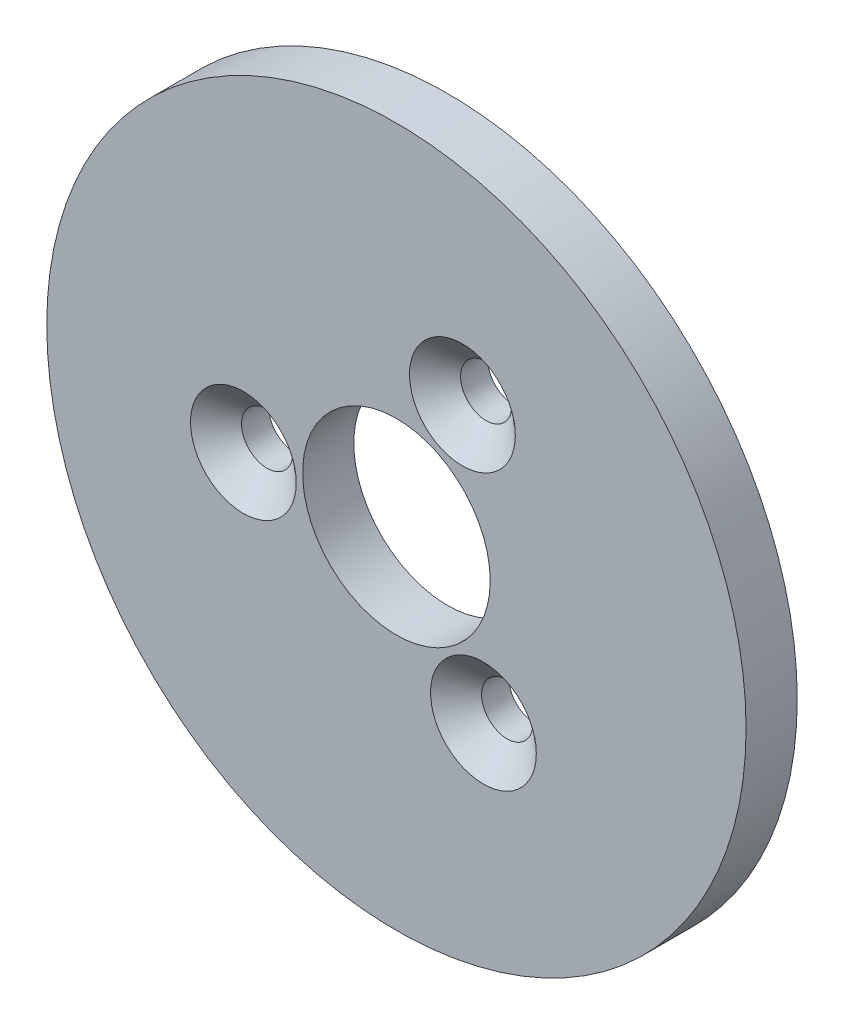
ISO-10303-21;
HEADER;
FILE_DESCRIPTION(('STEP AP214'),'2;1');
FILE_NAME('part.step','',(''),(''),'','','');
FILE_SCHEMA(('AUTOMOTIVE_DESIGN { 1 0 10303 214 1 1 1 1 }'));
ENDSEC;
DATA;
#1=APPLICATION_CONTEXT('core data for automotive mechanical design processes');
#2=APPLICATION_PROTOCOL_DEFINITION('international standard','automotive_design',2000,#1);
#3=PRODUCT_CONTEXT('',#1,'mechanical');
#4=PRODUCT('Part','Part','',(#3));
#5=PRODUCT_RELATED_PRODUCT_CATEGORY('part','',(#4));
#6=PRODUCT_DEFINITION_FORMATION('','',#4);
#7=PRODUCT_DEFINITION_CONTEXT('part definition',#1,'design');
#8=PRODUCT_DEFINITION('design','',#6,#7);
#9=PRODUCT_DEFINITION_SHAPE('','',#8);
#10=(LENGTH_UNIT() NAMED_UNIT(*) SI_UNIT(.MILLI.,.METRE.));
#11=(NAMED_UNIT(*) PLANE_ANGLE_UNIT() SI_UNIT($,.RADIAN.));
#12=(NAMED_UNIT(*) SI_UNIT($,.STERADIAN.) SOLID_ANGLE_UNIT());
#13=UNCERTAINTY_MEASURE_WITH_UNIT(LENGTH_MEASURE(1.E-05),#10,'distance_accuracy_value','');
#14=(GEOMETRIC_REPRESENTATION_CONTEXT(3) GLOBAL_UNCERTAINTY_ASSIGNED_CONTEXT((#13)) GLOBAL_UNIT_ASSIGNED_CONTEXT((#10,
#11,#12)) REPRESENTATION_CONTEXT('',''));
#15=CARTESIAN_POINT('',(0.,0.,0.));
#16=DIRECTION('',(0.,0.,1.));
#17=DIRECTION('',(1.,0.,0.));
#18=AXIS2_PLACEMENT_3D('',#15,#16,#17);
#19=CARTESIAN_POINT('',(0.,0.,3.));
#20=DIRECTION('',(0.,0.,-1.));
#21=DIRECTION('',(-1.,0.,0.));
#22=AXIS2_PLACEMENT_3D('',#19,#20,#21);
#23=CYLINDRICAL_SURFACE('',#22,20.5);
#24=CARTESIAN_POINT('',(0.,0.,3.));
#25=DIRECTION('',(0.,0.,1.));
#26=DIRECTION('',(1.,0.,0.));
#27=AXIS2_PLACEMENT_3D('',#24,#25,#26);
#28=CIRCLE('',#27,20.5);
#29=CARTESIAN_POINT('',(20.5,0.,3.));
#30=VERTEX_POINT('',#29);
#31=EDGE_CURVE('E57',#30,#30,#28,.T.);
#32=ORIENTED_EDGE('',*,*,#31,.F.);
#33=EDGE_LOOP('',(#32));
#34=FACE_BOUND('',#33,.T.);
#35=CARTESIAN_POINT('',(0.,0.,0.));
#36=DIRECTION('',(0.,0.,1.));
#37=DIRECTION('',(1.,0.,0.));
#38=AXIS2_PLACEMENT_3D('',#35,#36,#37);
#39=CIRCLE('',#38,20.5);
#40=CARTESIAN_POINT('',(20.5,0.,0.));
#41=VERTEX_POINT('',#40);
#42=EDGE_CURVE('E58',#41,#41,#39,.T.);
#43=ORIENTED_EDGE('',*,*,#42,.T.);
#44=EDGE_LOOP('',(#43));
#45=FACE_BOUND('',#44,.T.);
#46=ADVANCED_FACE('F31',(#34,#45),#23,.T.);
#47=CARTESIAN_POINT('',(0.,0.,3.));
#48=DIRECTION('',(0.,0.,1.));
#49=DIRECTION('',(1.,0.,0.));
#50=AXIS2_PLACEMENT_3D('',#47,#48,#49);
#51=PLANE('',#50);
#52=CARTESIAN_POINT('',(0.,0.,3.));
#53=DIRECTION('',(0.,0.,1.));
#54=DIRECTION('',(1.,0.,0.));
#55=AXIS2_PLACEMENT_3D('',#52,#53,#54);
#56=CIRCLE('',#55,5.5);
#57=CARTESIAN_POINT('',(5.5,0.,3.));
#58=VERTEX_POINT('',#57);
#59=EDGE_CURVE('E73',#58,#58,#56,.T.);
#60=ORIENTED_EDGE('',*,*,#59,.F.);
#61=EDGE_LOOP('',(#60));
#62=FACE_BOUND('',#61,.T.);
#63=CARTESIAN_POINT('',(-8.97185967817487,-0.711149713590536,3.));
#64=DIRECTION('',(0.,0.,1.));
#65=DIRECTION('',(1.,0.,0.));
#66=AXIS2_PLACEMENT_3D('',#63,#64,#65);
#67=CIRCLE('',#66,3.10000000000001);
#68=CARTESIAN_POINT('',(-5.87185967817486,-0.711149713590536,3.));
#69=VERTEX_POINT('',#68);
#70=EDGE_CURVE('E42',#69,#69,#67,.F.);
#71=ORIENTED_EDGE('',*,*,#70,.T.);
#72=EDGE_LOOP('',(#71));
#73=FACE_BOUND('',#72,.T.);
#74=CARTESIAN_POINT('',(3.87005612122401,8.12543325728398,3.));
#75=DIRECTION('',(0.,0.,1.));
#76=DIRECTION('',(1.,0.,0.));
#77=AXIS2_PLACEMENT_3D('',#74,#75,#76);
#78=CIRCLE('',#77,3.10000000000001);
#79=CARTESIAN_POINT('',(6.97005612122401,8.12543325728398,3.));
#80=VERTEX_POINT('',#79);
#81=EDGE_CURVE('E46',#80,#80,#78,.F.);
#82=ORIENTED_EDGE('',*,*,#81,.T.);
#83=EDGE_LOOP('',(#82));
#84=FACE_BOUND('',#83,.T.);
#85=CARTESIAN_POINT('',(5.10180355695087,-7.41428354369345,3.));
#86=DIRECTION('',(0.,0.,1.));
#87=DIRECTION('',(1.,0.,0.));
#88=AXIS2_PLACEMENT_3D('',#85,#86,#87);
#89=CIRCLE('',#88,3.10000000000001);
#90=CARTESIAN_POINT('',(8.20180355695087,-7.41428354369345,3.));
#91=VERTEX_POINT('',#90);
#92=EDGE_CURVE('E51',#91,#91,#89,.F.);
#93=ORIENTED_EDGE('',*,*,#92,.T.);
#94=EDGE_LOOP('',(#93));
#95=FACE_BOUND('',#94,.T.);
#96=ORIENTED_EDGE('',*,*,#31,.T.);
#97=EDGE_LOOP('',(#96));
#98=FACE_BOUND('',#97,.T.);
#99=ADVANCED_FACE('F88',(#62,#73,#84,#95,#98),#51,.T.);
#100=CARTESIAN_POINT('',(0.,0.,0.));
#101=DIRECTION('',(0.,0.,1.));
#102=DIRECTION('',(1.,0.,0.));
#103=AXIS2_PLACEMENT_3D('',#100,#101,#102);
#104=PLANE('',#103);
#105=CARTESIAN_POINT('',(0.,0.,0.));
#106=DIRECTION('',(0.,0.,1.));
#107=DIRECTION('',(1.,0.,0.));
#108=AXIS2_PLACEMENT_3D('',#105,#106,#107);
#109=CIRCLE('',#108,5.5);
#110=CARTESIAN_POINT('',(5.5,0.,0.));
#111=VERTEX_POINT('',#110);
#112=EDGE_CURVE('E70',#111,#111,#109,.T.);
#113=ORIENTED_EDGE('',*,*,#112,.T.);
#114=EDGE_LOOP('',(#113));
#115=FACE_BOUND('',#114,.T.);
#116=CARTESIAN_POINT('',(5.10180355695087,-7.41428354369345,0.));
#117=DIRECTION('',(0.,0.,1.));
#118=DIRECTION('',(1.,0.,0.));
#119=AXIS2_PLACEMENT_3D('',#116,#117,#118);
#120=CIRCLE('',#119,1.5);
#121=CARTESIAN_POINT('',(6.60180355695086,-7.41428354369345,0.));
#122=VERTEX_POINT('',#121);
#123=EDGE_CURVE('E66',#122,#122,#120,.T.);
#124=ORIENTED_EDGE('',*,*,#123,.T.);
#125=EDGE_LOOP('',(#124));
#126=FACE_BOUND('',#125,.T.);
#127=CARTESIAN_POINT('',(3.87005612122401,8.12543325728398,0.));
#128=DIRECTION('',(0.,0.,1.));
#129=DIRECTION('',(1.,0.,0.));
#130=AXIS2_PLACEMENT_3D('',#127,#128,#129);
#131=CIRCLE('',#130,1.5);
#132=CARTESIAN_POINT('',(5.37005612122401,8.12543325728398,0.));
#133=VERTEX_POINT('',#132);
#134=EDGE_CURVE('E67',#133,#133,#131,.T.);
#135=ORIENTED_EDGE('',*,*,#134,.T.);
#136=EDGE_LOOP('',(#135));
#137=FACE_BOUND('',#136,.T.);
#138=CARTESIAN_POINT('',(-8.97185967817487,-0.711149713590536,0.));
#139=DIRECTION('',(0.,0.,1.));
#140=DIRECTION('',(1.,0.,0.));
#141=AXIS2_PLACEMENT_3D('',#138,#139,#140);
#142=CIRCLE('',#141,1.5);
#143=CARTESIAN_POINT('',(-7.47185967817487,-0.711149713590536,0.));
#144=VERTEX_POINT('',#143);
#145=EDGE_CURVE('E61',#144,#144,#142,.T.);
#146=ORIENTED_EDGE('',*,*,#145,.T.);
#147=EDGE_LOOP('',(#146));
#148=FACE_BOUND('',#147,.T.);
#149=ORIENTED_EDGE('',*,*,#42,.F.);
#150=EDGE_LOOP('',(#149));
#151=FACE_BOUND('',#150,.T.);
#152=ADVANCED_FACE('F79',(#115,#126,#137,#148,#151),#104,.F.);
#153=CARTESIAN_POINT('',(-8.97185967817487,-0.711149713590536,0.));
#154=DIRECTION('',(0.,0.,1.));
#155=DIRECTION('',(1.,0.,0.));
#156=AXIS2_PLACEMENT_3D('',#153,#154,#155);
#157=CYLINDRICAL_SURFACE('',#156,1.5);
#158=CARTESIAN_POINT('',(-8.97185967817487,-0.711149713590536,1.60914121949403));
#159=DIRECTION('',(0.,0.,1.));
#160=DIRECTION('',(1.,0.,0.));
#161=AXIS2_PLACEMENT_3D('',#158,#159,#160);
#162=CIRCLE('',#161,1.5);
#163=CARTESIAN_POINT('',(-7.47185967817487,-0.711149713590536,1.60914121949403));
#164=VERTEX_POINT('',#163);
#165=EDGE_CURVE('E54',#164,#164,#162,.T.);
#166=ORIENTED_EDGE('',*,*,#165,.T.);
#167=EDGE_LOOP('',(#166));
#168=FACE_BOUND('',#167,.T.);
#169=ORIENTED_EDGE('',*,*,#145,.F.);
#170=EDGE_LOOP('',(#169));
#171=FACE_BOUND('',#170,.T.);
#172=ADVANCED_FACE('F106',(#168,#171),#157,.F.);
#173=CARTESIAN_POINT('',(3.87005612122401,8.12543325728398,0.));
#174=DIRECTION('',(0.,0.,1.));
#175=DIRECTION('',(1.,0.,0.));
#176=AXIS2_PLACEMENT_3D('',#173,#174,#175);
#177=CYLINDRICAL_SURFACE('',#176,1.5);
#178=CARTESIAN_POINT('',(3.87005612122401,8.12543325728398,1.60914121949403));
#179=DIRECTION('',(0.,0.,1.));
#180=DIRECTION('',(1.,0.,0.));
#181=AXIS2_PLACEMENT_3D('',#178,#179,#180);
#182=CIRCLE('',#181,1.5);
#183=CARTESIAN_POINT('',(5.37005612122401,8.12543325728398,1.60914121949403));
#184=VERTEX_POINT('',#183);
#185=EDGE_CURVE('E38',#184,#184,#182,.T.);
#186=ORIENTED_EDGE('',*,*,#185,.T.);
#187=EDGE_LOOP('',(#186));
#188=FACE_BOUND('',#187,.T.);
#189=ORIENTED_EDGE('',*,*,#134,.F.);
#190=EDGE_LOOP('',(#189));
#191=FACE_BOUND('',#190,.T.);
#192=ADVANCED_FACE('F111',(#188,#191),#177,.F.);
#193=CARTESIAN_POINT('',(5.10180355695087,-7.41428354369345,0.));
#194=DIRECTION('',(0.,0.,1.));
#195=DIRECTION('',(1.,0.,0.));
#196=AXIS2_PLACEMENT_3D('',#193,#194,#195);
#197=CYLINDRICAL_SURFACE('',#196,1.5);
#198=CARTESIAN_POINT('',(5.10180355695087,-7.41428354369345,1.60914121949403));
#199=DIRECTION('',(0.,0.,1.));
#200=DIRECTION('',(1.,0.,0.));
#201=AXIS2_PLACEMENT_3D('',#198,#199,#200);
#202=CIRCLE('',#201,1.5);
#203=CARTESIAN_POINT('',(6.60180355695086,-7.41428354369345,1.60914121949403));
#204=VERTEX_POINT('',#203);
#205=EDGE_CURVE('E10',#204,#204,#202,.T.);
#206=ORIENTED_EDGE('',*,*,#205,.T.);
#207=EDGE_LOOP('',(#206));
#208=FACE_BOUND('',#207,.T.);
#209=ORIENTED_EDGE('',*,*,#123,.F.);
#210=EDGE_LOOP('',(#209));
#211=FACE_BOUND('',#210,.T.);
#212=ADVANCED_FACE('F118',(#208,#211),#197,.F.);
#213=CARTESIAN_POINT('',(-8.97185967817487,-0.711149713590536,1.60914121949403));
#214=DIRECTION('',(0.,0.,1.));
#215=DIRECTION('',(1.,0.,0.));
#216=AXIS2_PLACEMENT_3D('',#213,#214,#215);
#217=CONICAL_SURFACE('',#216,1.5,0.855211333477223);
#218=ORIENTED_EDGE('',*,*,#70,.F.);
#219=EDGE_LOOP('',(#218));
#220=FACE_BOUND('',#219,.T.);
#221=ORIENTED_EDGE('',*,*,#165,.F.);
#222=EDGE_LOOP('',(#221));
#223=FACE_BOUND('',#222,.T.);
#224=ADVANCED_FACE('F115',(#220,#223),#217,.F.);
#225=CARTESIAN_POINT('',(3.87005612122401,8.12543325728398,1.60914121949403));
#226=DIRECTION('',(0.,0.,1.));
#227=DIRECTION('',(1.,0.,0.));
#228=AXIS2_PLACEMENT_3D('',#225,#226,#227);
#229=CONICAL_SURFACE('',#228,1.5,0.855211333477223);
#230=ORIENTED_EDGE('',*,*,#81,.F.);
#231=EDGE_LOOP('',(#230));
#232=FACE_BOUND('',#231,.T.);
#233=ORIENTED_EDGE('',*,*,#185,.F.);
#234=EDGE_LOOP('',(#233));
#235=FACE_BOUND('',#234,.T.);
#236=ADVANCED_FACE('F117',(#232,#235),#229,.F.);
#237=CARTESIAN_POINT('',(5.10180355695087,-7.41428354369345,1.60914121949403));
#238=DIRECTION('',(0.,0.,1.));
#239=DIRECTION('',(1.,0.,0.));
#240=AXIS2_PLACEMENT_3D('',#237,#238,#239);
#241=CONICAL_SURFACE('',#240,1.5,0.855211333477222);
#242=ORIENTED_EDGE('',*,*,#92,.F.);
#243=EDGE_LOOP('',(#242));
#244=FACE_BOUND('',#243,.T.);
#245=ORIENTED_EDGE('',*,*,#205,.F.);
#246=EDGE_LOOP('',(#245));
#247=FACE_BOUND('',#246,.T.);
#248=ADVANCED_FACE('F33',(#244,#247),#241,.F.);
#249=CARTESIAN_POINT('',(0.,0.,0.));
#250=DIRECTION('',(0.,0.,1.));
#251=DIRECTION('',(1.,0.,0.));
#252=AXIS2_PLACEMENT_3D('',#249,#250,#251);
#253=CYLINDRICAL_SURFACE('',#252,5.5);
#254=ORIENTED_EDGE('',*,*,#112,.F.);
#255=EDGE_LOOP('',(#254));
#256=FACE_BOUND('',#255,.T.);
#257=ORIENTED_EDGE('',*,*,#59,.T.);
#258=EDGE_LOOP('',(#257));
#259=FACE_BOUND('',#258,.T.);
#260=ADVANCED_FACE('F82',(#256,#259),#253,.F.);
#261=CLOSED_SHELL('',(#46,#99,#152,#172,#192,#212,#224,#236,#248,#260));
#262=MANIFOLD_SOLID_BREP('B2',#261);
#263=ADVANCED_BREP_SHAPE_REPRESENTATION('',(#18,#262),#14);
#264=SHAPE_DEFINITION_REPRESENTATION(#9,#263);
ENDSEC;
END-ISO-10303-21;
